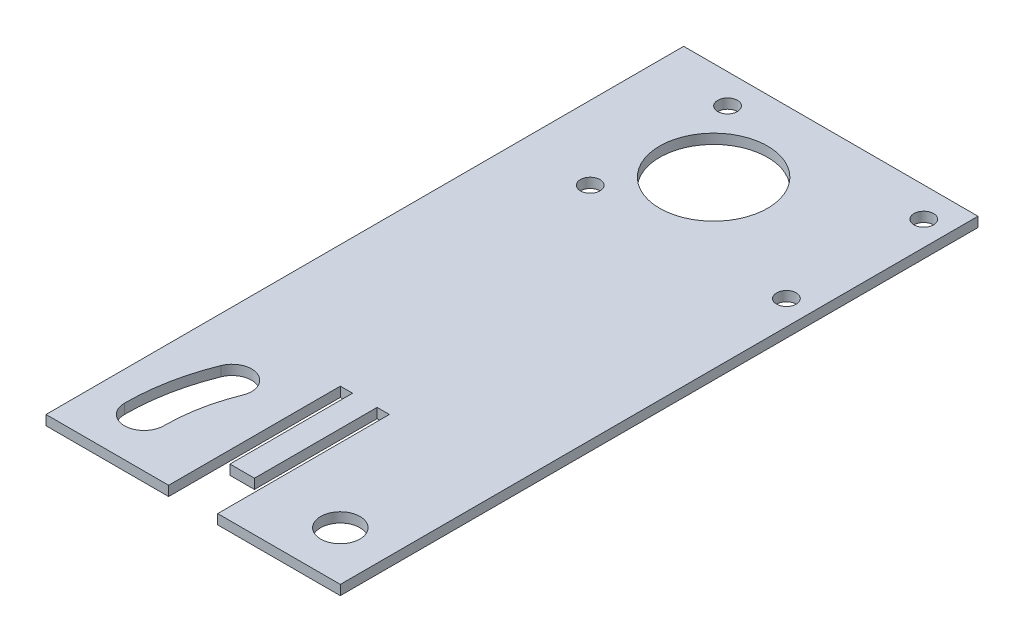
ISO-10303-21;
HEADER;
FILE_DESCRIPTION(('STEP AP214'),'2;1');
FILE_NAME('part.step','',(''),(''),'','','');
FILE_SCHEMA(('AUTOMOTIVE_DESIGN { 1 0 10303 214 1 1 1 1 }'));
ENDSEC;
DATA;
#1=APPLICATION_CONTEXT('core data for automotive mechanical design processes');
#2=APPLICATION_PROTOCOL_DEFINITION('international standard','automotive_design',2000,#1);
#3=PRODUCT_CONTEXT('',#1,'mechanical');
#4=PRODUCT('Part','Part','',(#3));
#5=PRODUCT_RELATED_PRODUCT_CATEGORY('part','',(#4));
#6=PRODUCT_DEFINITION_FORMATION('','',#4);
#7=PRODUCT_DEFINITION_CONTEXT('part definition',#1,'design');
#8=PRODUCT_DEFINITION('design','',#6,#7);
#9=PRODUCT_DEFINITION_SHAPE('','',#8);
#10=(LENGTH_UNIT() NAMED_UNIT(*) SI_UNIT(.MILLI.,.METRE.));
#11=(NAMED_UNIT(*) PLANE_ANGLE_UNIT() SI_UNIT($,.RADIAN.));
#12=(NAMED_UNIT(*) SI_UNIT($,.STERADIAN.) SOLID_ANGLE_UNIT());
#13=UNCERTAINTY_MEASURE_WITH_UNIT(LENGTH_MEASURE(1.E-05),#10,'distance_accuracy_value','');
#14=(GEOMETRIC_REPRESENTATION_CONTEXT(3) GLOBAL_UNCERTAINTY_ASSIGNED_CONTEXT((#13)) GLOBAL_UNIT_ASSIGNED_CONTEXT((#10,
#11,#12)) REPRESENTATION_CONTEXT('',''));
#15=CARTESIAN_POINT('',(0.,0.,0.));
#16=DIRECTION('',(0.,0.,1.));
#17=DIRECTION('',(1.,0.,0.));
#18=AXIS2_PLACEMENT_3D('',#15,#16,#17);
#19=CARTESIAN_POINT('',(5.,-2.,0.));
#20=DIRECTION('',(0.,0.,1.));
#21=DIRECTION('',(1.,0.,0.));
#22=AXIS2_PLACEMENT_3D('',#19,#20,#21);
#23=PLANE('',#22);
#24=DIRECTION('',(1.,0.,0.));
#25=VECTOR('',#24,1.);
#26=CARTESIAN_POINT('',(5.,0.,0.));
#27=LINE('',#26,#25);
#28=CARTESIAN_POINT('',(5.,0.,0.));
#29=VERTEX_POINT('',#28);
#30=CARTESIAN_POINT('',(30.,0.,0.));
#31=VERTEX_POINT('',#30);
#32=EDGE_CURVE('E211',#29,#31,#27,.T.);
#33=ORIENTED_EDGE('',*,*,#32,.F.);
#34=DIRECTION('',(0.,1.,0.));
#35=VECTOR('',#34,1.);
#36=CARTESIAN_POINT('',(5.,-2.,0.));
#37=LINE('',#36,#35);
#38=CARTESIAN_POINT('',(5.,-2.,0.));
#39=VERTEX_POINT('',#38);
#40=EDGE_CURVE('E11',#39,#29,#37,.T.);
#41=ORIENTED_EDGE('',*,*,#40,.F.);
#42=DIRECTION('',(1.,0.,0.));
#43=VECTOR('',#42,1.);
#44=CARTESIAN_POINT('',(5.,-2.,0.));
#45=LINE('',#44,#43);
#46=CARTESIAN_POINT('',(30.,-2.,0.));
#47=VERTEX_POINT('',#46);
#48=EDGE_CURVE('E215',#39,#47,#45,.T.);
#49=ORIENTED_EDGE('',*,*,#48,.T.);
#50=DIRECTION('',(0.,1.,0.));
#51=VECTOR('',#50,1.);
#52=CARTESIAN_POINT('',(30.,-2.,0.));
#53=LINE('',#52,#51);
#54=EDGE_CURVE('E43',#47,#31,#53,.T.);
#55=ORIENTED_EDGE('',*,*,#54,.T.);
#56=EDGE_LOOP('',(#33,#41,#49,#55));
#57=FACE_BOUND('',#56,.T.);
#58=ADVANCED_FACE('F40',(#57),#23,.T.);
#59=CARTESIAN_POINT('',(4.99999999999999,-2.,-35.));
#60=DIRECTION('',(-1.,0.,0.));
#61=DIRECTION('',(0.,0.,1.));
#62=AXIS2_PLACEMENT_3D('',#59,#60,#61);
#63=PLANE('',#62);
#64=DIRECTION('',(0.,0.,1.));
#65=VECTOR('',#64,1.);
#66=CARTESIAN_POINT('',(4.99999999999999,0.,-35.));
#67=LINE('',#66,#65);
#68=CARTESIAN_POINT('',(4.99999999999999,0.,-35.));
#69=VERTEX_POINT('',#68);
#70=EDGE_CURVE('E220',#69,#29,#67,.T.);
#71=ORIENTED_EDGE('',*,*,#70,.F.);
#72=DIRECTION('',(0.,1.,0.));
#73=VECTOR('',#72,1.);
#74=CARTESIAN_POINT('',(4.99999999999999,-2.,-35.));
#75=LINE('',#74,#73);
#76=CARTESIAN_POINT('',(4.99999999999999,-2.,-35.));
#77=VERTEX_POINT('',#76);
#78=EDGE_CURVE('E49',#77,#69,#75,.T.);
#79=ORIENTED_EDGE('',*,*,#78,.F.);
#80=DIRECTION('',(0.,0.,1.));
#81=VECTOR('',#80,1.);
#82=CARTESIAN_POINT('',(4.99999999999999,-2.,-35.));
#83=LINE('',#82,#81);
#84=EDGE_CURVE('E260',#77,#39,#83,.T.);
#85=ORIENTED_EDGE('',*,*,#84,.T.);
#86=ORIENTED_EDGE('',*,*,#40,.T.);
#87=EDGE_LOOP('',(#71,#79,#85,#86));
#88=FACE_BOUND('',#87,.T.);
#89=ADVANCED_FACE('F353',(#88),#63,.T.);
#90=CARTESIAN_POINT('',(2.49999999999999,-2.,-35.));
#91=DIRECTION('',(0.,0.,1.));
#92=DIRECTION('',(1.,0.,0.));
#93=AXIS2_PLACEMENT_3D('',#90,#91,#92);
#94=PLANE('',#93);
#95=DIRECTION('',(1.,0.,0.));
#96=VECTOR('',#95,1.);
#97=CARTESIAN_POINT('',(2.49999999999999,0.,-35.));
#98=LINE('',#97,#96);
#99=CARTESIAN_POINT('',(2.49999999999999,0.,-35.));
#100=VERTEX_POINT('',#99);
#101=EDGE_CURVE('E303',#100,#69,#98,.T.);
#102=ORIENTED_EDGE('',*,*,#101,.F.);
#103=DIRECTION('',(0.,1.,0.));
#104=VECTOR('',#103,1.);
#105=CARTESIAN_POINT('',(2.49999999999999,-2.,-35.));
#106=LINE('',#105,#104);
#107=CARTESIAN_POINT('',(2.49999999999999,-2.,-35.));
#108=VERTEX_POINT('',#107);
#109=EDGE_CURVE('E312',#108,#100,#106,.T.);
#110=ORIENTED_EDGE('',*,*,#109,.F.);
#111=DIRECTION('',(1.,0.,0.));
#112=VECTOR('',#111,1.);
#113=CARTESIAN_POINT('',(2.49999999999999,-2.,-35.));
#114=LINE('',#113,#112);
#115=EDGE_CURVE('E256',#108,#77,#114,.T.);
#116=ORIENTED_EDGE('',*,*,#115,.T.);
#117=ORIENTED_EDGE('',*,*,#78,.T.);
#118=EDGE_LOOP('',(#102,#110,#116,#117));
#119=FACE_BOUND('',#118,.T.);
#120=ADVANCED_FACE('F389',(#119),#94,.T.);
#121=CARTESIAN_POINT('',(2.49999999999999,-2.,-35.));
#122=DIRECTION('',(1.,0.,0.));
#123=DIRECTION('',(0.,0.,-1.));
#124=AXIS2_PLACEMENT_3D('',#121,#122,#123);
#125=PLANE('',#124);
#126=DIRECTION('',(0.,0.,-1.));
#127=VECTOR('',#126,1.);
#128=CARTESIAN_POINT('',(2.49999999999999,0.,-35.));
#129=LINE('',#128,#127);
#130=CARTESIAN_POINT('',(2.49999999999999,0.,-10.));
#131=VERTEX_POINT('',#130);
#132=EDGE_CURVE('E299',#131,#100,#129,.T.);
#133=ORIENTED_EDGE('',*,*,#132,.F.);
#134=DIRECTION('',(0.,1.,0.));
#135=VECTOR('',#134,1.);
#136=CARTESIAN_POINT('',(2.49999999999999,-2.,-10.));
#137=LINE('',#136,#135);
#138=CARTESIAN_POINT('',(2.49999999999999,-2.,-10.));
#139=VERTEX_POINT('',#138);
#140=EDGE_CURVE('E315',#139,#131,#137,.T.);
#141=ORIENTED_EDGE('',*,*,#140,.F.);
#142=DIRECTION('',(0.,0.,-1.));
#143=VECTOR('',#142,1.);
#144=CARTESIAN_POINT('',(2.49999999999999,-2.,-35.));
#145=LINE('',#144,#143);
#146=EDGE_CURVE('E252',#139,#108,#145,.T.);
#147=ORIENTED_EDGE('',*,*,#146,.T.);
#148=ORIENTED_EDGE('',*,*,#109,.T.);
#149=EDGE_LOOP('',(#133,#141,#147,#148));
#150=FACE_BOUND('',#149,.T.);
#151=ADVANCED_FACE('F386',(#150),#125,.T.);
#152=CARTESIAN_POINT('',(-2.50000000000001,-2.,-10.));
#153=DIRECTION('',(0.,0.,1.));
#154=DIRECTION('',(1.,0.,0.));
#155=AXIS2_PLACEMENT_3D('',#152,#153,#154);
#156=PLANE('',#155);
#157=DIRECTION('',(1.,0.,0.));
#158=VECTOR('',#157,1.);
#159=CARTESIAN_POINT('',(-2.50000000000001,0.,-10.));
#160=LINE('',#159,#158);
#161=CARTESIAN_POINT('',(-2.50000000000001,0.,-10.));
#162=VERTEX_POINT('',#161);
#163=EDGE_CURVE('E295',#162,#131,#160,.T.);
#164=ORIENTED_EDGE('',*,*,#163,.F.);
#165=DIRECTION('',(0.,1.,0.));
#166=VECTOR('',#165,1.);
#167=CARTESIAN_POINT('',(-2.50000000000001,-2.,-10.));
#168=LINE('',#167,#166);
#169=CARTESIAN_POINT('',(-2.50000000000001,-2.,-10.));
#170=VERTEX_POINT('',#169);
#171=EDGE_CURVE('E318',#170,#162,#168,.T.);
#172=ORIENTED_EDGE('',*,*,#171,.F.);
#173=DIRECTION('',(1.,0.,0.));
#174=VECTOR('',#173,1.);
#175=CARTESIAN_POINT('',(-2.50000000000001,-2.,-10.));
#176=LINE('',#175,#174);
#177=EDGE_CURVE('E248',#170,#139,#176,.T.);
#178=ORIENTED_EDGE('',*,*,#177,.T.);
#179=ORIENTED_EDGE('',*,*,#140,.T.);
#180=EDGE_LOOP('',(#164,#172,#178,#179));
#181=FACE_BOUND('',#180,.T.);
#182=ADVANCED_FACE('F383',(#181),#156,.T.);
#183=CARTESIAN_POINT('',(-2.50000000000001,-2.,-35.));
#184=DIRECTION('',(-1.,0.,0.));
#185=DIRECTION('',(0.,0.,1.));
#186=AXIS2_PLACEMENT_3D('',#183,#184,#185);
#187=PLANE('',#186);
#188=DIRECTION('',(0.,0.,1.));
#189=VECTOR('',#188,1.);
#190=CARTESIAN_POINT('',(-2.50000000000001,0.,-35.));
#191=LINE('',#190,#189);
#192=CARTESIAN_POINT('',(-2.50000000000001,0.,-35.));
#193=VERTEX_POINT('',#192);
#194=EDGE_CURVE('E291',#193,#162,#191,.T.);
#195=ORIENTED_EDGE('',*,*,#194,.F.);
#196=DIRECTION('',(0.,1.,0.));
#197=VECTOR('',#196,1.);
#198=CARTESIAN_POINT('',(-2.50000000000001,-2.,-35.));
#199=LINE('',#198,#197);
#200=CARTESIAN_POINT('',(-2.50000000000001,-2.,-35.));
#201=VERTEX_POINT('',#200);
#202=EDGE_CURVE('E321',#201,#193,#199,.T.);
#203=ORIENTED_EDGE('',*,*,#202,.F.);
#204=DIRECTION('',(0.,0.,1.));
#205=VECTOR('',#204,1.);
#206=CARTESIAN_POINT('',(-2.50000000000001,-2.,-35.));
#207=LINE('',#206,#205);
#208=EDGE_CURVE('E244',#201,#170,#207,.T.);
#209=ORIENTED_EDGE('',*,*,#208,.T.);
#210=ORIENTED_EDGE('',*,*,#171,.T.);
#211=EDGE_LOOP('',(#195,#203,#209,#210));
#212=FACE_BOUND('',#211,.T.);
#213=ADVANCED_FACE('F379',(#212),#187,.T.);
#214=CARTESIAN_POINT('',(-2.50000000000001,-2.,-35.));
#215=DIRECTION('',(0.,0.,1.));
#216=DIRECTION('',(1.,0.,0.));
#217=AXIS2_PLACEMENT_3D('',#214,#215,#216);
#218=PLANE('',#217);
#219=DIRECTION('',(1.,0.,0.));
#220=VECTOR('',#219,1.);
#221=CARTESIAN_POINT('',(-2.50000000000001,0.,-35.));
#222=LINE('',#221,#220);
#223=CARTESIAN_POINT('',(-5.00000000000001,0.,-35.));
#224=VERTEX_POINT('',#223);
#225=EDGE_CURVE('E287',#224,#193,#222,.T.);
#226=ORIENTED_EDGE('',*,*,#225,.F.);
#227=DIRECTION('',(0.,1.,0.));
#228=VECTOR('',#227,1.);
#229=CARTESIAN_POINT('',(-5.00000000000001,-2.,-35.));
#230=LINE('',#229,#228);
#231=CARTESIAN_POINT('',(-5.00000000000001,-2.,-35.));
#232=VERTEX_POINT('',#231);
#233=EDGE_CURVE('E324',#232,#224,#230,.T.);
#234=ORIENTED_EDGE('',*,*,#233,.F.);
#235=DIRECTION('',(1.,0.,0.));
#236=VECTOR('',#235,1.);
#237=CARTESIAN_POINT('',(-2.50000000000001,-2.,-35.));
#238=LINE('',#237,#236);
#239=EDGE_CURVE('E240',#232,#201,#238,.T.);
#240=ORIENTED_EDGE('',*,*,#239,.T.);
#241=ORIENTED_EDGE('',*,*,#202,.T.);
#242=EDGE_LOOP('',(#226,#234,#240,#241));
#243=FACE_BOUND('',#242,.T.);
#244=ADVANCED_FACE('F375',(#243),#218,.T.);
#245=CARTESIAN_POINT('',(-5.00000000000001,-2.,-35.));
#246=DIRECTION('',(1.,0.,0.));
#247=DIRECTION('',(0.,0.,-1.));
#248=AXIS2_PLACEMENT_3D('',#245,#246,#247);
#249=PLANE('',#248);
#250=DIRECTION('',(0.,0.,-1.));
#251=VECTOR('',#250,1.);
#252=CARTESIAN_POINT('',(-5.00000000000001,0.,-35.));
#253=LINE('',#252,#251);
#254=CARTESIAN_POINT('',(-5.,0.,0.));
#255=VERTEX_POINT('',#254);
#256=EDGE_CURVE('E283',#255,#224,#253,.T.);
#257=ORIENTED_EDGE('',*,*,#256,.F.);
#258=DIRECTION('',(0.,1.,0.));
#259=VECTOR('',#258,1.);
#260=CARTESIAN_POINT('',(-5.,-2.,0.));
#261=LINE('',#260,#259);
#262=CARTESIAN_POINT('',(-5.,-2.,0.));
#263=VERTEX_POINT('',#262);
#264=EDGE_CURVE('E327',#263,#255,#261,.T.);
#265=ORIENTED_EDGE('',*,*,#264,.F.);
#266=DIRECTION('',(0.,0.,-1.));
#267=VECTOR('',#266,1.);
#268=CARTESIAN_POINT('',(-5.00000000000001,-2.,-35.));
#269=LINE('',#268,#267);
#270=EDGE_CURVE('E236',#263,#232,#269,.T.);
#271=ORIENTED_EDGE('',*,*,#270,.T.);
#272=ORIENTED_EDGE('',*,*,#233,.T.);
#273=EDGE_LOOP('',(#257,#265,#271,#272));
#274=FACE_BOUND('',#273,.T.);
#275=ADVANCED_FACE('F371',(#274),#249,.T.);
#276=CARTESIAN_POINT('',(-30.,-2.,0.));
#277=DIRECTION('',(0.,0.,1.));
#278=DIRECTION('',(1.,0.,0.));
#279=AXIS2_PLACEMENT_3D('',#276,#277,#278);
#280=PLANE('',#279);
#281=DIRECTION('',(1.,0.,0.));
#282=VECTOR('',#281,1.);
#283=CARTESIAN_POINT('',(-30.,0.,0.));
#284=LINE('',#283,#282);
#285=CARTESIAN_POINT('',(-30.,0.,0.));
#286=VERTEX_POINT('',#285);
#287=EDGE_CURVE('E279',#286,#255,#284,.T.);
#288=ORIENTED_EDGE('',*,*,#287,.F.);
#289=DIRECTION('',(0.,1.,0.));
#290=VECTOR('',#289,1.);
#291=CARTESIAN_POINT('',(-30.,-2.,0.));
#292=LINE('',#291,#290);
#293=CARTESIAN_POINT('',(-30.,-2.,0.));
#294=VERTEX_POINT('',#293);
#295=EDGE_CURVE('E330',#294,#286,#292,.T.);
#296=ORIENTED_EDGE('',*,*,#295,.F.);
#297=DIRECTION('',(1.,0.,0.));
#298=VECTOR('',#297,1.);
#299=CARTESIAN_POINT('',(-30.,-2.,0.));
#300=LINE('',#299,#298);
#301=EDGE_CURVE('E232',#294,#263,#300,.T.);
#302=ORIENTED_EDGE('',*,*,#301,.T.);
#303=ORIENTED_EDGE('',*,*,#264,.T.);
#304=EDGE_LOOP('',(#288,#296,#302,#303));
#305=FACE_BOUND('',#304,.T.);
#306=ADVANCED_FACE('F367',(#305),#280,.T.);
#307=CARTESIAN_POINT('',(-30.,-2.,-130.));
#308=DIRECTION('',(-1.,0.,0.));
#309=DIRECTION('',(0.,0.,1.));
#310=AXIS2_PLACEMENT_3D('',#307,#308,#309);
#311=PLANE('',#310);
#312=DIRECTION('',(0.,0.,1.));
#313=VECTOR('',#312,1.);
#314=CARTESIAN_POINT('',(-30.,0.,-130.));
#315=LINE('',#314,#313);
#316=CARTESIAN_POINT('',(-30.,0.,-130.));
#317=VERTEX_POINT('',#316);
#318=EDGE_CURVE('E275',#317,#286,#315,.T.);
#319=ORIENTED_EDGE('',*,*,#318,.F.);
#320=DIRECTION('',(0.,1.,0.));
#321=VECTOR('',#320,1.);
#322=CARTESIAN_POINT('',(-30.,-2.,-130.));
#323=LINE('',#322,#321);
#324=CARTESIAN_POINT('',(-30.,-2.,-130.));
#325=VERTEX_POINT('',#324);
#326=EDGE_CURVE('E333',#325,#317,#323,.T.);
#327=ORIENTED_EDGE('',*,*,#326,.F.);
#328=DIRECTION('',(0.,0.,1.));
#329=VECTOR('',#328,1.);
#330=CARTESIAN_POINT('',(-30.,-2.,-130.));
#331=LINE('',#330,#329);
#332=EDGE_CURVE('E228',#325,#294,#331,.T.);
#333=ORIENTED_EDGE('',*,*,#332,.T.);
#334=ORIENTED_EDGE('',*,*,#295,.T.);
#335=EDGE_LOOP('',(#319,#327,#333,#334));
#336=FACE_BOUND('',#335,.T.);
#337=ADVANCED_FACE('F365',(#336),#311,.T.);
#338=CARTESIAN_POINT('',(30.,-2.,-130.));
#339=DIRECTION('',(0.,0.,-1.));
#340=DIRECTION('',(-1.,0.,0.));
#341=AXIS2_PLACEMENT_3D('',#338,#339,#340);
#342=PLANE('',#341);
#343=DIRECTION('',(-1.,0.,0.));
#344=VECTOR('',#343,1.);
#345=CARTESIAN_POINT('',(30.,0.,-130.));
#346=LINE('',#345,#344);
#347=CARTESIAN_POINT('',(30.,0.,-130.));
#348=VERTEX_POINT('',#347);
#349=EDGE_CURVE('E271',#348,#317,#346,.T.);
#350=ORIENTED_EDGE('',*,*,#349,.F.);
#351=DIRECTION('',(0.,1.,0.));
#352=VECTOR('',#351,1.);
#353=CARTESIAN_POINT('',(30.,-2.,-130.));
#354=LINE('',#353,#352);
#355=CARTESIAN_POINT('',(30.,-2.,-130.));
#356=VERTEX_POINT('',#355);
#357=EDGE_CURVE('E335',#356,#348,#354,.T.);
#358=ORIENTED_EDGE('',*,*,#357,.F.);
#359=DIRECTION('',(-1.,0.,0.));
#360=VECTOR('',#359,1.);
#361=CARTESIAN_POINT('',(30.,-2.,-130.));
#362=LINE('',#361,#360);
#363=EDGE_CURVE('E224',#356,#325,#362,.T.);
#364=ORIENTED_EDGE('',*,*,#363,.T.);
#365=ORIENTED_EDGE('',*,*,#326,.T.);
#366=EDGE_LOOP('',(#350,#358,#364,#365));
#367=FACE_BOUND('',#366,.T.);
#368=ADVANCED_FACE('F361',(#367),#342,.T.);
#369=CARTESIAN_POINT('',(30.,-2.,0.));
#370=DIRECTION('',(1.,0.,0.));
#371=DIRECTION('',(0.,0.,-1.));
#372=AXIS2_PLACEMENT_3D('',#369,#370,#371);
#373=PLANE('',#372);
#374=DIRECTION('',(0.,0.,-1.));
#375=VECTOR('',#374,1.);
#376=CARTESIAN_POINT('',(30.,0.,0.));
#377=LINE('',#376,#375);
#378=EDGE_CURVE('E267',#31,#348,#377,.T.);
#379=ORIENTED_EDGE('',*,*,#378,.F.);
#380=ORIENTED_EDGE('',*,*,#54,.F.);
#381=DIRECTION('',(0.,0.,-1.));
#382=VECTOR('',#381,1.);
#383=CARTESIAN_POINT('',(30.,-2.,0.));
#384=LINE('',#383,#382);
#385=EDGE_CURVE('E219',#47,#356,#384,.T.);
#386=ORIENTED_EDGE('',*,*,#385,.T.);
#387=ORIENTED_EDGE('',*,*,#357,.T.);
#388=EDGE_LOOP('',(#379,#380,#386,#387));
#389=FACE_BOUND('',#388,.T.);
#390=ADVANCED_FACE('F347',(#389),#373,.T.);
#391=CARTESIAN_POINT('',(0.,-2.,0.));
#392=DIRECTION('',(0.,1.,0.));
#393=DIRECTION('',(0.,0.,1.));
#394=AXIS2_PLACEMENT_3D('',#391,#392,#393);
#395=PLANE('',#394);
#396=CARTESIAN_POINT('',(25.,-2.,-95.945));
#397=DIRECTION('',(0.,1.,0.));
#398=DIRECTION('',(0.,0.,1.));
#399=AXIS2_PLACEMENT_3D('',#396,#397,#398);
#400=CIRCLE('',#399,2.00000000000001);
#401=CARTESIAN_POINT('',(25.,-2.,-93.945));
#402=VERTEX_POINT('',#401);
#403=EDGE_CURVE('E183',#402,#402,#400,.T.);
#404=ORIENTED_EDGE('',*,*,#403,.T.);
#405=EDGE_LOOP('',(#404));
#406=FACE_BOUND('',#405,.T.);
#407=CARTESIAN_POINT('',(-15.,-2.,-123.945));
#408=DIRECTION('',(0.,1.,0.));
#409=DIRECTION('',(0.,0.,1.));
#410=AXIS2_PLACEMENT_3D('',#407,#408,#409);
#411=CIRCLE('',#410,2.);
#412=CARTESIAN_POINT('',(-15.,-2.,-121.945));
#413=VERTEX_POINT('',#412);
#414=EDGE_CURVE('E700',#413,#413,#411,.T.);
#415=ORIENTED_EDGE('',*,*,#414,.T.);
#416=EDGE_LOOP('',(#415));
#417=FACE_BOUND('',#416,.T.);
#418=CARTESIAN_POINT('',(-15.,-2.,-95.945));
#419=DIRECTION('',(0.,1.,0.));
#420=DIRECTION('',(0.,0.,1.));
#421=AXIS2_PLACEMENT_3D('',#418,#419,#420);
#422=CIRCLE('',#421,2.);
#423=CARTESIAN_POINT('',(-15.,-2.,-93.945));
#424=VERTEX_POINT('',#423);
#425=EDGE_CURVE('E704',#424,#424,#422,.T.);
#426=ORIENTED_EDGE('',*,*,#425,.T.);
#427=EDGE_LOOP('',(#426));
#428=FACE_BOUND('',#427,.T.);
#429=CARTESIAN_POINT('',(-3.84499999999998,-2.,-109.945));
#430=DIRECTION('',(0.,1.,0.));
#431=DIRECTION('',(0.,0.,1.));
#432=AXIS2_PLACEMENT_3D('',#429,#430,#431);
#433=CIRCLE('',#432,11.);
#434=CARTESIAN_POINT('',(-3.84499999999998,-2.,-98.945));
#435=VERTEX_POINT('',#434);
#436=EDGE_CURVE('E710',#435,#435,#433,.T.);
#437=ORIENTED_EDGE('',*,*,#436,.T.);
#438=EDGE_LOOP('',(#437));
#439=FACE_BOUND('',#438,.T.);
#440=CARTESIAN_POINT('',(25.,-2.,-123.945));
#441=DIRECTION('',(0.,1.,0.));
#442=DIRECTION('',(0.,0.,1.));
#443=AXIS2_PLACEMENT_3D('',#440,#441,#442);
#444=CIRCLE('',#443,2.00000000000001);
#445=CARTESIAN_POINT('',(25.,-2.,-121.945));
#446=VERTEX_POINT('',#445);
#447=EDGE_CURVE('E716',#446,#446,#444,.T.);
#448=ORIENTED_EDGE('',*,*,#447,.T.);
#449=EDGE_LOOP('',(#448));
#450=FACE_BOUND('',#449,.T.);
#451=CARTESIAN_POINT('',(-17.0809924354783,-2.,-25.));
#452=DIRECTION('',(0.,1.,0.));
#453=DIRECTION('',(0.,0.,1.));
#454=AXIS2_PLACEMENT_3D('',#451,#452,#453);
#455=CIRCLE('',#454,3.99999999999999);
#456=CARTESIAN_POINT('',(-13.3728931919305,-2.,-23.5));
#457=VERTEX_POINT('',#456);
#458=CARTESIAN_POINT('',(-20.7890916790261,-2.,-26.5));
#459=VERTEX_POINT('',#458);
#460=EDGE_CURVE('E163',#457,#459,#455,.T.);
#461=ORIENTED_EDGE('',*,*,#460,.T.);
#462=CARTESIAN_POINT('',(20.,-2.,-10.));
#463=DIRECTION('',(0.,1.,0.));
#464=DIRECTION('',(0.,0.,1.));
#465=AXIS2_PLACEMENT_3D('',#462,#463,#464);
#466=CIRCLE('',#465,44.);
#467=CARTESIAN_POINT('',(-24.,-2.,-10.));
#468=VERTEX_POINT('',#467);
#469=EDGE_CURVE('E156',#459,#468,#466,.T.);
#470=ORIENTED_EDGE('',*,*,#469,.T.);
#471=CARTESIAN_POINT('',(-20.,-2.,-10.));
#472=DIRECTION('',(0.,1.,0.));
#473=DIRECTION('',(0.,0.,1.));
#474=AXIS2_PLACEMENT_3D('',#471,#472,#473);
#475=CIRCLE('',#474,4.);
#476=CARTESIAN_POINT('',(-16.,-2.,-10.));
#477=VERTEX_POINT('',#476);
#478=EDGE_CURVE('E166',#468,#477,#475,.T.);
#479=ORIENTED_EDGE('',*,*,#478,.T.);
#480=CARTESIAN_POINT('',(20.,-2.,-10.));
#481=DIRECTION('',(0.,-1.,0.));
#482=DIRECTION('',(0.,0.,1.));
#483=AXIS2_PLACEMENT_3D('',#480,#481,#482);
#484=CIRCLE('',#483,36.);
#485=EDGE_CURVE('E57',#477,#457,#484,.T.);
#486=ORIENTED_EDGE('',*,*,#485,.T.);
#487=EDGE_LOOP('',(#461,#470,#479,#486));
#488=FACE_BOUND('',#487,.T.);
#489=CARTESIAN_POINT('',(20.,-2.,-10.));
#490=DIRECTION('',(0.,1.,0.));
#491=DIRECTION('',(0.,0.,1.));
#492=AXIS2_PLACEMENT_3D('',#489,#490,#491);
#493=CIRCLE('',#492,4.00000000000001);
#494=CARTESIAN_POINT('',(20.,-2.,-6.));
#495=VERTEX_POINT('',#494);
#496=EDGE_CURVE('E207',#495,#495,#493,.T.);
#497=ORIENTED_EDGE('',*,*,#496,.T.);
#498=EDGE_LOOP('',(#497));
#499=FACE_BOUND('',#498,.T.);
#500=ORIENTED_EDGE('',*,*,#48,.F.);
#501=ORIENTED_EDGE('',*,*,#84,.F.);
#502=ORIENTED_EDGE('',*,*,#115,.F.);
#503=ORIENTED_EDGE('',*,*,#146,.F.);
#504=ORIENTED_EDGE('',*,*,#177,.F.);
#505=ORIENTED_EDGE('',*,*,#208,.F.);
#506=ORIENTED_EDGE('',*,*,#239,.F.);
#507=ORIENTED_EDGE('',*,*,#270,.F.);
#508=ORIENTED_EDGE('',*,*,#301,.F.);
#509=ORIENTED_EDGE('',*,*,#332,.F.);
#510=ORIENTED_EDGE('',*,*,#363,.F.);
#511=ORIENTED_EDGE('',*,*,#385,.F.);
#512=EDGE_LOOP('',(#500,#501,#502,#503,#504,#505,#506,#507,#508,#509,#510,#511));
#513=FACE_BOUND('',#512,.T.);
#514=ADVANCED_FACE('F171',(#406,#417,#428,#439,#450,#488,#499,#513),#395,.F.);
#515=CARTESIAN_POINT('',(0.,0.,0.));
#516=DIRECTION('',(0.,1.,0.));
#517=DIRECTION('',(0.,0.,1.));
#518=AXIS2_PLACEMENT_3D('',#515,#516,#517);
#519=PLANE('',#518);
#520=CARTESIAN_POINT('',(25.,0.,-95.945));
#521=DIRECTION('',(0.,1.,0.));
#522=DIRECTION('',(0.,0.,1.));
#523=AXIS2_PLACEMENT_3D('',#520,#521,#522);
#524=CIRCLE('',#523,2.00000000000001);
#525=CARTESIAN_POINT('',(25.,0.,-93.945));
#526=VERTEX_POINT('',#525);
#527=EDGE_CURVE('E696',#526,#526,#524,.T.);
#528=ORIENTED_EDGE('',*,*,#527,.F.);
#529=EDGE_LOOP('',(#528));
#530=FACE_BOUND('',#529,.T.);
#531=CARTESIAN_POINT('',(-15.,0.,-123.945));
#532=DIRECTION('',(0.,1.,0.));
#533=DIRECTION('',(0.,0.,1.));
#534=AXIS2_PLACEMENT_3D('',#531,#532,#533);
#535=CIRCLE('',#534,2.);
#536=CARTESIAN_POINT('',(-15.,0.,-121.945));
#537=VERTEX_POINT('',#536);
#538=EDGE_CURVE('E724',#537,#537,#535,.T.);
#539=ORIENTED_EDGE('',*,*,#538,.F.);
#540=EDGE_LOOP('',(#539));
#541=FACE_BOUND('',#540,.T.);
#542=CARTESIAN_POINT('',(-15.,0.,-95.945));
#543=DIRECTION('',(0.,1.,0.));
#544=DIRECTION('',(0.,0.,1.));
#545=AXIS2_PLACEMENT_3D('',#542,#543,#544);
#546=CIRCLE('',#545,2.);
#547=CARTESIAN_POINT('',(-15.,0.,-93.945));
#548=VERTEX_POINT('',#547);
#549=EDGE_CURVE('E728',#548,#548,#546,.T.);
#550=ORIENTED_EDGE('',*,*,#549,.F.);
#551=EDGE_LOOP('',(#550));
#552=FACE_BOUND('',#551,.T.);
#553=CARTESIAN_POINT('',(-3.84499999999998,0.,-109.945));
#554=DIRECTION('',(0.,1.,0.));
#555=DIRECTION('',(0.,0.,1.));
#556=AXIS2_PLACEMENT_3D('',#553,#554,#555);
#557=CIRCLE('',#556,11.);
#558=CARTESIAN_POINT('',(-3.84499999999998,0.,-98.945));
#559=VERTEX_POINT('',#558);
#560=EDGE_CURVE('E731',#559,#559,#557,.T.);
#561=ORIENTED_EDGE('',*,*,#560,.F.);
#562=EDGE_LOOP('',(#561));
#563=FACE_BOUND('',#562,.T.);
#564=CARTESIAN_POINT('',(25.,0.,-123.945));
#565=DIRECTION('',(0.,1.,0.));
#566=DIRECTION('',(0.,0.,1.));
#567=AXIS2_PLACEMENT_3D('',#564,#565,#566);
#568=CIRCLE('',#567,2.00000000000001);
#569=CARTESIAN_POINT('',(25.,0.,-121.945));
#570=VERTEX_POINT('',#569);
#571=EDGE_CURVE('E720',#570,#570,#568,.T.);
#572=ORIENTED_EDGE('',*,*,#571,.F.);
#573=EDGE_LOOP('',(#572));
#574=FACE_BOUND('',#573,.T.);
#575=CARTESIAN_POINT('',(20.,0.,-10.));
#576=DIRECTION('',(0.,1.,0.));
#577=DIRECTION('',(0.,0.,1.));
#578=AXIS2_PLACEMENT_3D('',#575,#576,#577);
#579=CIRCLE('',#578,44.);
#580=CARTESIAN_POINT('',(-20.7890916790261,0.,-26.5));
#581=VERTEX_POINT('',#580);
#582=CARTESIAN_POINT('',(-24.,0.,-10.));
#583=VERTEX_POINT('',#582);
#584=EDGE_CURVE('E65',#581,#583,#579,.T.);
#585=ORIENTED_EDGE('',*,*,#584,.F.);
#586=CARTESIAN_POINT('',(-17.0809924354783,0.,-25.));
#587=DIRECTION('',(0.,1.,0.));
#588=DIRECTION('',(0.,0.,1.));
#589=AXIS2_PLACEMENT_3D('',#586,#587,#588);
#590=CIRCLE('',#589,3.99999999999999);
#591=CARTESIAN_POINT('',(-13.3728931919305,0.,-23.5));
#592=VERTEX_POINT('',#591);
#593=EDGE_CURVE('E175',#592,#581,#590,.T.);
#594=ORIENTED_EDGE('',*,*,#593,.F.);
#595=CARTESIAN_POINT('',(20.,0.,-10.));
#596=DIRECTION('',(0.,-1.,0.));
#597=DIRECTION('',(0.,0.,1.));
#598=AXIS2_PLACEMENT_3D('',#595,#596,#597);
#599=CIRCLE('',#598,36.);
#600=CARTESIAN_POINT('',(-16.,0.,-10.));
#601=VERTEX_POINT('',#600);
#602=EDGE_CURVE('E180',#601,#592,#599,.T.);
#603=ORIENTED_EDGE('',*,*,#602,.F.);
#604=CARTESIAN_POINT('',(-20.,0.,-10.));
#605=DIRECTION('',(0.,1.,0.));
#606=DIRECTION('',(0.,0.,1.));
#607=AXIS2_PLACEMENT_3D('',#604,#605,#606);
#608=CIRCLE('',#607,4.);
#609=EDGE_CURVE('E192',#583,#601,#608,.T.);
#610=ORIENTED_EDGE('',*,*,#609,.F.);
#611=EDGE_LOOP('',(#585,#594,#603,#610));
#612=FACE_BOUND('',#611,.T.);
#613=CARTESIAN_POINT('',(20.,0.,-10.));
#614=DIRECTION('',(0.,1.,0.));
#615=DIRECTION('',(0.,0.,1.));
#616=AXIS2_PLACEMENT_3D('',#613,#614,#615);
#617=CIRCLE('',#616,4.00000000000001);
#618=CARTESIAN_POINT('',(20.,0.,-6.));
#619=VERTEX_POINT('',#618);
#620=EDGE_CURVE('E201',#619,#619,#617,.T.);
#621=ORIENTED_EDGE('',*,*,#620,.F.);
#622=EDGE_LOOP('',(#621));
#623=FACE_BOUND('',#622,.T.);
#624=ORIENTED_EDGE('',*,*,#32,.T.);
#625=ORIENTED_EDGE('',*,*,#378,.T.);
#626=ORIENTED_EDGE('',*,*,#349,.T.);
#627=ORIENTED_EDGE('',*,*,#318,.T.);
#628=ORIENTED_EDGE('',*,*,#287,.T.);
#629=ORIENTED_EDGE('',*,*,#256,.T.);
#630=ORIENTED_EDGE('',*,*,#225,.T.);
#631=ORIENTED_EDGE('',*,*,#194,.T.);
#632=ORIENTED_EDGE('',*,*,#163,.T.);
#633=ORIENTED_EDGE('',*,*,#132,.T.);
#634=ORIENTED_EDGE('',*,*,#101,.T.);
#635=ORIENTED_EDGE('',*,*,#70,.T.);
#636=EDGE_LOOP('',(#624,#625,#626,#627,#628,#629,#630,#631,#632,#633,#634,#635));
#637=FACE_BOUND('',#636,.T.);
#638=ADVANCED_FACE('F349',(#530,#541,#552,#563,#574,#612,#623,#637),#519,.T.);
#639=CARTESIAN_POINT('',(20.,-2.,-10.));
#640=DIRECTION('',(0.,1.,0.));
#641=DIRECTION('',(0.,0.,1.));
#642=AXIS2_PLACEMENT_3D('',#639,#640,#641);
#643=CYLINDRICAL_SURFACE('',#642,4.00000000000001);
#644=ORIENTED_EDGE('',*,*,#496,.F.);
#645=EDGE_LOOP('',(#644));
#646=FACE_BOUND('',#645,.T.);
#647=ORIENTED_EDGE('',*,*,#620,.T.);
#648=EDGE_LOOP('',(#647));
#649=FACE_BOUND('',#648,.T.);
#650=ADVANCED_FACE('F498',(#646,#649),#643,.F.);
#651=CARTESIAN_POINT('',(20.,-2.,-10.));
#652=DIRECTION('',(0.,1.,0.));
#653=DIRECTION('',(0.,0.,1.));
#654=AXIS2_PLACEMENT_3D('',#651,#652,#653);
#655=CYLINDRICAL_SURFACE('',#654,44.);
#656=ORIENTED_EDGE('',*,*,#584,.T.);
#657=DIRECTION('',(0.,1.,0.));
#658=VECTOR('',#657,1.);
#659=CARTESIAN_POINT('',(-24.,-2.,-10.));
#660=LINE('',#659,#658);
#661=EDGE_CURVE('E152',#468,#583,#660,.T.);
#662=ORIENTED_EDGE('',*,*,#661,.F.);
#663=ORIENTED_EDGE('',*,*,#469,.F.);
#664=DIRECTION('',(0.,1.,0.));
#665=VECTOR('',#664,1.);
#666=CARTESIAN_POINT('',(-20.7890916790261,-2.,-26.5));
#667=LINE('',#666,#665);
#668=EDGE_CURVE('E198',#459,#581,#667,.T.);
#669=ORIENTED_EDGE('',*,*,#668,.T.);
#670=EDGE_LOOP('',(#656,#662,#663,#669));
#671=FACE_BOUND('',#670,.T.);
#672=ADVANCED_FACE('F154',(#671),#655,.F.);
#673=CARTESIAN_POINT('',(-17.0809924354783,-2.,-25.));
#674=DIRECTION('',(0.,1.,0.));
#675=DIRECTION('',(0.,0.,1.));
#676=AXIS2_PLACEMENT_3D('',#673,#674,#675);
#677=CYLINDRICAL_SURFACE('',#676,3.99999999999999);
#678=ORIENTED_EDGE('',*,*,#593,.T.);
#679=ORIENTED_EDGE('',*,*,#668,.F.);
#680=ORIENTED_EDGE('',*,*,#460,.F.);
#681=DIRECTION('',(0.,1.,0.));
#682=VECTOR('',#681,1.);
#683=CARTESIAN_POINT('',(-13.3728931919305,-2.,-23.5));
#684=LINE('',#683,#682);
#685=EDGE_CURVE('E202',#457,#592,#684,.T.);
#686=ORIENTED_EDGE('',*,*,#685,.T.);
#687=EDGE_LOOP('',(#678,#679,#680,#686));
#688=FACE_BOUND('',#687,.T.);
#689=ADVANCED_FACE('F517',(#688),#677,.F.);
#690=CARTESIAN_POINT('',(20.,-2.,-10.));
#691=DIRECTION('',(0.,1.,0.));
#692=DIRECTION('',(0.,0.,1.));
#693=AXIS2_PLACEMENT_3D('',#690,#691,#692);
#694=CYLINDRICAL_SURFACE('',#693,36.);
#695=ORIENTED_EDGE('',*,*,#602,.T.);
#696=ORIENTED_EDGE('',*,*,#685,.F.);
#697=ORIENTED_EDGE('',*,*,#485,.F.);
#698=DIRECTION('',(0.,1.,0.));
#699=VECTOR('',#698,1.);
#700=CARTESIAN_POINT('',(-16.,-2.,-10.));
#701=LINE('',#700,#699);
#702=EDGE_CURVE('E162',#477,#601,#701,.T.);
#703=ORIENTED_EDGE('',*,*,#702,.T.);
#704=EDGE_LOOP('',(#695,#696,#697,#703));
#705=FACE_BOUND('',#704,.T.);
#706=ADVANCED_FACE('F526',(#705),#694,.T.);
#707=CARTESIAN_POINT('',(-20.,-2.,-10.));
#708=DIRECTION('',(0.,1.,0.));
#709=DIRECTION('',(0.,0.,1.));
#710=AXIS2_PLACEMENT_3D('',#707,#708,#709);
#711=CYLINDRICAL_SURFACE('',#710,4.);
#712=ORIENTED_EDGE('',*,*,#609,.T.);
#713=ORIENTED_EDGE('',*,*,#702,.F.);
#714=ORIENTED_EDGE('',*,*,#478,.F.);
#715=ORIENTED_EDGE('',*,*,#661,.T.);
#716=EDGE_LOOP('',(#712,#713,#714,#715));
#717=FACE_BOUND('',#716,.T.);
#718=ADVANCED_FACE('F167',(#717),#711,.F.);
#719=CARTESIAN_POINT('',(25.,-10.,-123.945));
#720=DIRECTION('',(0.,1.,0.));
#721=DIRECTION('',(0.,0.,1.));
#722=AXIS2_PLACEMENT_3D('',#719,#720,#721);
#723=CYLINDRICAL_SURFACE('',#722,2.00000000000001);
#724=ORIENTED_EDGE('',*,*,#571,.T.);
#725=EDGE_LOOP('',(#724));
#726=FACE_BOUND('',#725,.T.);
#727=ORIENTED_EDGE('',*,*,#447,.F.);
#728=EDGE_LOOP('',(#727));
#729=FACE_BOUND('',#728,.T.);
#730=ADVANCED_FACE('F543',(#726,#729),#723,.F.);
#731=CARTESIAN_POINT('',(-3.84499999999998,-10.,-109.945));
#732=DIRECTION('',(0.,1.,0.));
#733=DIRECTION('',(0.,0.,1.));
#734=AXIS2_PLACEMENT_3D('',#731,#732,#733);
#735=CYLINDRICAL_SURFACE('',#734,11.);
#736=ORIENTED_EDGE('',*,*,#560,.T.);
#737=EDGE_LOOP('',(#736));
#738=FACE_BOUND('',#737,.T.);
#739=ORIENTED_EDGE('',*,*,#436,.F.);
#740=EDGE_LOOP('',(#739));
#741=FACE_BOUND('',#740,.T.);
#742=ADVANCED_FACE('F551',(#738,#741),#735,.F.);
#743=CARTESIAN_POINT('',(-15.,-10.,-95.945));
#744=DIRECTION('',(0.,1.,0.));
#745=DIRECTION('',(0.,0.,1.));
#746=AXIS2_PLACEMENT_3D('',#743,#744,#745);
#747=CYLINDRICAL_SURFACE('',#746,2.);
#748=ORIENTED_EDGE('',*,*,#549,.T.);
#749=EDGE_LOOP('',(#748));
#750=FACE_BOUND('',#749,.T.);
#751=ORIENTED_EDGE('',*,*,#425,.F.);
#752=EDGE_LOOP('',(#751));
#753=FACE_BOUND('',#752,.T.);
#754=ADVANCED_FACE('F561',(#750,#753),#747,.F.);
#755=CARTESIAN_POINT('',(-15.,-10.,-123.945));
#756=DIRECTION('',(0.,1.,0.));
#757=DIRECTION('',(0.,0.,1.));
#758=AXIS2_PLACEMENT_3D('',#755,#756,#757);
#759=CYLINDRICAL_SURFACE('',#758,2.);
#760=ORIENTED_EDGE('',*,*,#538,.T.);
#761=EDGE_LOOP('',(#760));
#762=FACE_BOUND('',#761,.T.);
#763=ORIENTED_EDGE('',*,*,#414,.F.);
#764=EDGE_LOOP('',(#763));
#765=FACE_BOUND('',#764,.T.);
#766=ADVANCED_FACE('F571',(#762,#765),#759,.F.);
#767=CARTESIAN_POINT('',(25.,-10.,-95.945));
#768=DIRECTION('',(0.,1.,0.));
#769=DIRECTION('',(0.,0.,1.));
#770=AXIS2_PLACEMENT_3D('',#767,#768,#769);
#771=CYLINDRICAL_SURFACE('',#770,2.00000000000001);
#772=ORIENTED_EDGE('',*,*,#527,.T.);
#773=EDGE_LOOP('',(#772));
#774=FACE_BOUND('',#773,.T.);
#775=ORIENTED_EDGE('',*,*,#403,.F.);
#776=EDGE_LOOP('',(#775));
#777=FACE_BOUND('',#776,.T.);
#778=ADVANCED_FACE('F581',(#774,#777),#771,.F.);
#779=CLOSED_SHELL('',(#58,#89,#120,#151,#182,#213,#244,#275,#306,#337,#368,#390,#514,#638,#650,
#672,#689,#706,#718,#730,#742,#754,#766,#778));
#780=MANIFOLD_SOLID_BREP('B2',#779);
#781=ADVANCED_BREP_SHAPE_REPRESENTATION('',(#18,#780),#14);
#782=SHAPE_DEFINITION_REPRESENTATION(#9,#781);
ENDSEC;
END-ISO-10303-21;
